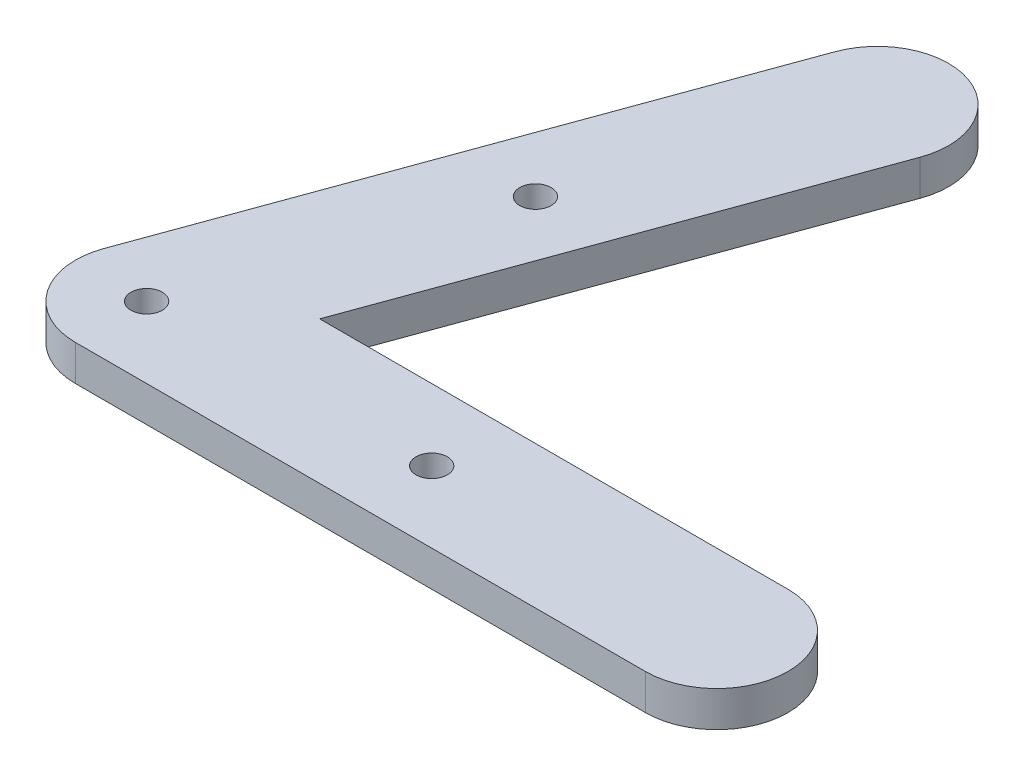
ISO-10303-21;
HEADER;
FILE_DESCRIPTION(('STEP AP214'),'2;1');
FILE_NAME('part.step','',(''),(''),'','','');
FILE_SCHEMA(('AUTOMOTIVE_DESIGN { 1 0 10303 214 1 1 1 1 }'));
ENDSEC;
DATA;
#1=APPLICATION_CONTEXT('core data for automotive mechanical design processes');
#2=APPLICATION_PROTOCOL_DEFINITION('international standard','automotive_design',2000,#1);
#3=PRODUCT_CONTEXT('',#1,'mechanical');
#4=PRODUCT('Part','Part','',(#3));
#5=PRODUCT_RELATED_PRODUCT_CATEGORY('part','',(#4));
#6=PRODUCT_DEFINITION_FORMATION('','',#4);
#7=PRODUCT_DEFINITION_CONTEXT('part definition',#1,'design');
#8=PRODUCT_DEFINITION('design','',#6,#7);
#9=PRODUCT_DEFINITION_SHAPE('','',#8);
#10=(LENGTH_UNIT() NAMED_UNIT(*) SI_UNIT(.MILLI.,.METRE.));
#11=(NAMED_UNIT(*) PLANE_ANGLE_UNIT() SI_UNIT($,.RADIAN.));
#12=(NAMED_UNIT(*) SI_UNIT($,.STERADIAN.) SOLID_ANGLE_UNIT());
#13=UNCERTAINTY_MEASURE_WITH_UNIT(LENGTH_MEASURE(1.E-05),#10,'distance_accuracy_value','');
#14=(GEOMETRIC_REPRESENTATION_CONTEXT(3) GLOBAL_UNCERTAINTY_ASSIGNED_CONTEXT((#13)) GLOBAL_UNIT_ASSIGNED_CONTEXT((#10,
#11,#12)) REPRESENTATION_CONTEXT('',''));
#15=CARTESIAN_POINT('',(0.,0.,0.));
#16=DIRECTION('',(0.,0.,1.));
#17=DIRECTION('',(1.,0.,0.));
#18=AXIS2_PLACEMENT_3D('',#15,#16,#17);
#19=CARTESIAN_POINT('',(-11.934096283981,6.35,-4.34365582023595));
#20=DIRECTION('',(-0.93969262078591,0.,-0.342020143325665));
#21=DIRECTION('',(-0.342020143325665,0.,0.93969262078591));
#22=AXIS2_PLACEMENT_3D('',#19,#20,#21);
#23=PLANE('',#22);
#24=DIRECTION('',(0.342020143325665,0.,-0.93969262078591));
#25=VECTOR('',#24,1.);
#26=CARTESIAN_POINT('',(-11.934096283981,0.,-4.34365582023595));
#27=LINE('',#26,#25);
#28=CARTESIAN_POINT('',(-11.934096283981,0.,-4.34365582023595));
#29=VERTEX_POINT('',#28);
#30=CARTESIAN_POINT('',(22.8151502779066,0.,-99.8164260920844));
#31=VERTEX_POINT('',#30);
#32=EDGE_CURVE('E129',#29,#31,#27,.T.);
#33=ORIENTED_EDGE('',*,*,#32,.F.);
#34=DIRECTION('',(0.,-1.,0.));
#35=VECTOR('',#34,1.);
#36=CARTESIAN_POINT('',(-11.934096283981,6.35,-4.34365582023595));
#37=LINE('',#36,#35);
#38=CARTESIAN_POINT('',(-11.934096283981,6.35,-4.34365582023595));
#39=VERTEX_POINT('',#38);
#40=EDGE_CURVE('E11',#39,#29,#37,.T.);
#41=ORIENTED_EDGE('',*,*,#40,.F.);
#42=DIRECTION('',(0.342020143325665,0.,-0.93969262078591));
#43=VECTOR('',#42,1.);
#44=CARTESIAN_POINT('',(-11.934096283981,6.35,-4.34365582023595));
#45=LINE('',#44,#43);
#46=CARTESIAN_POINT('',(22.8151502779066,6.35,-99.8164260920844));
#47=VERTEX_POINT('',#46);
#48=EDGE_CURVE('E147',#39,#47,#45,.T.);
#49=ORIENTED_EDGE('',*,*,#48,.T.);
#50=DIRECTION('',(0.,-1.,0.));
#51=VECTOR('',#50,1.);
#52=CARTESIAN_POINT('',(22.8151502779066,6.35,-99.8164260920844));
#53=LINE('',#52,#51);
#54=EDGE_CURVE('E84',#47,#31,#53,.T.);
#55=ORIENTED_EDGE('',*,*,#54,.T.);
#56=EDGE_LOOP('',(#33,#41,#49,#55));
#57=FACE_BOUND('',#56,.T.);
#58=ADVANCED_FACE('F37',(#57),#23,.T.);
#59=CARTESIAN_POINT('',(0.,6.35,0.));
#60=DIRECTION('',(0.,-1.,0.));
#61=DIRECTION('',(0.,0.,-1.));
#62=AXIS2_PLACEMENT_3D('',#59,#60,#61);
#63=CYLINDRICAL_SURFACE('',#62,12.7);
#64=CARTESIAN_POINT('',(0.,0.,0.));
#65=DIRECTION('',(0.,1.,0.));
#66=DIRECTION('',(0.,0.,1.));
#67=AXIS2_PLACEMENT_3D('',#64,#65,#66);
#68=CIRCLE('',#67,12.7);
#69=CARTESIAN_POINT('',(0.,0.,12.7));
#70=VERTEX_POINT('',#69);
#71=EDGE_CURVE('E132',#29,#70,#68,.T.);
#72=ORIENTED_EDGE('',*,*,#71,.T.);
#73=DIRECTION('',(0.,-1.,0.));
#74=VECTOR('',#73,1.);
#75=CARTESIAN_POINT('',(0.,6.35,12.7));
#76=LINE('',#75,#74);
#77=CARTESIAN_POINT('',(0.,6.35,12.7));
#78=VERTEX_POINT('',#77);
#79=EDGE_CURVE('E45',#78,#70,#76,.T.);
#80=ORIENTED_EDGE('',*,*,#79,.F.);
#81=CARTESIAN_POINT('',(0.,6.35,0.));
#82=DIRECTION('',(0.,1.,0.));
#83=DIRECTION('',(0.,0.,1.));
#84=AXIS2_PLACEMENT_3D('',#81,#82,#83);
#85=CIRCLE('',#84,12.7);
#86=EDGE_CURVE('E184',#39,#78,#85,.T.);
#87=ORIENTED_EDGE('',*,*,#86,.F.);
#88=ORIENTED_EDGE('',*,*,#40,.T.);
#89=EDGE_LOOP('',(#72,#80,#87,#88));
#90=FACE_BOUND('',#89,.T.);
#91=ADVANCED_FACE('F175',(#90),#63,.T.);
#92=CARTESIAN_POINT('',(0.,6.35,12.7));
#93=DIRECTION('',(0.,0.,-1.));
#94=DIRECTION('',(-1.,0.,0.));
#95=AXIS2_PLACEMENT_3D('',#92,#93,#94);
#96=PLANE('',#95);
#97=DIRECTION('',(1.,0.,0.));
#98=VECTOR('',#97,1.);
#99=CARTESIAN_POINT('',(0.,0.,12.7));
#100=LINE('',#99,#98);
#101=CARTESIAN_POINT('',(101.6,0.,12.7));
#102=VERTEX_POINT('',#101);
#103=EDGE_CURVE('E135',#70,#102,#100,.T.);
#104=ORIENTED_EDGE('',*,*,#103,.T.);
#105=DIRECTION('',(0.,-1.,0.));
#106=VECTOR('',#105,1.);
#107=CARTESIAN_POINT('',(101.6,6.35,12.7));
#108=LINE('',#107,#106);
#109=CARTESIAN_POINT('',(101.6,6.35,12.7));
#110=VERTEX_POINT('',#109);
#111=EDGE_CURVE('E151',#110,#102,#108,.T.);
#112=ORIENTED_EDGE('',*,*,#111,.F.);
#113=DIRECTION('',(1.,0.,0.));
#114=VECTOR('',#113,1.);
#115=CARTESIAN_POINT('',(0.,6.35,12.7));
#116=LINE('',#115,#114);
#117=EDGE_CURVE('E121',#78,#110,#116,.T.);
#118=ORIENTED_EDGE('',*,*,#117,.F.);
#119=ORIENTED_EDGE('',*,*,#79,.T.);
#120=EDGE_LOOP('',(#104,#112,#118,#119));
#121=FACE_BOUND('',#120,.T.);
#122=ADVANCED_FACE('F158',(#121),#96,.F.);
#123=CARTESIAN_POINT('',(101.6,6.35,0.));
#124=DIRECTION('',(0.,-1.,0.));
#125=DIRECTION('',(0.,0.,-1.));
#126=AXIS2_PLACEMENT_3D('',#123,#124,#125);
#127=CYLINDRICAL_SURFACE('',#126,12.7);
#128=CARTESIAN_POINT('',(101.6,0.,0.));
#129=DIRECTION('',(0.,1.,0.));
#130=DIRECTION('',(0.,0.,1.));
#131=AXIS2_PLACEMENT_3D('',#128,#129,#130);
#132=CIRCLE('',#131,12.7);
#133=CARTESIAN_POINT('',(101.6,0.,-12.7));
#134=VERTEX_POINT('',#133);
#135=EDGE_CURVE('E137',#102,#134,#132,.T.);
#136=ORIENTED_EDGE('',*,*,#135,.T.);
#137=DIRECTION('',(0.,-1.,0.));
#138=VECTOR('',#137,1.);
#139=CARTESIAN_POINT('',(101.6,6.35,-12.7));
#140=LINE('',#139,#138);
#141=CARTESIAN_POINT('',(101.6,6.35,-12.7));
#142=VERTEX_POINT('',#141);
#143=EDGE_CURVE('E109',#142,#134,#140,.T.);
#144=ORIENTED_EDGE('',*,*,#143,.F.);
#145=CARTESIAN_POINT('',(101.6,6.35,0.));
#146=DIRECTION('',(0.,1.,0.));
#147=DIRECTION('',(0.,0.,1.));
#148=AXIS2_PLACEMENT_3D('',#145,#146,#147);
#149=CIRCLE('',#148,12.7);
#150=EDGE_CURVE('E118',#110,#142,#149,.T.);
#151=ORIENTED_EDGE('',*,*,#150,.F.);
#152=ORIENTED_EDGE('',*,*,#111,.T.);
#153=EDGE_LOOP('',(#136,#144,#151,#152));
#154=FACE_BOUND('',#153,.T.);
#155=ADVANCED_FACE('F167',(#154),#127,.T.);
#156=CARTESIAN_POINT('',(0.,6.35,-12.7));
#157=DIRECTION('',(0.,0.,-1.));
#158=DIRECTION('',(-1.,0.,0.));
#159=AXIS2_PLACEMENT_3D('',#156,#157,#158);
#160=PLANE('',#159);
#161=DIRECTION('',(1.,0.,0.));
#162=VECTOR('',#161,1.);
#163=CARTESIAN_POINT('',(0.,0.,-12.7));
#164=LINE('',#163,#162);
#165=CARTESIAN_POINT('',(18.1374796856248,0.,-12.7));
#166=VERTEX_POINT('',#165);
#167=EDGE_CURVE('E108',#166,#134,#164,.T.);
#168=ORIENTED_EDGE('',*,*,#167,.F.);
#169=DIRECTION('',(0.,-1.,0.));
#170=VECTOR('',#169,1.);
#171=CARTESIAN_POINT('',(18.1374796856248,6.35,-12.7));
#172=LINE('',#171,#170);
#173=CARTESIAN_POINT('',(18.1374796856248,6.35,-12.7));
#174=VERTEX_POINT('',#173);
#175=EDGE_CURVE('E102',#174,#166,#172,.T.);
#176=ORIENTED_EDGE('',*,*,#175,.F.);
#177=DIRECTION('',(1.,0.,0.));
#178=VECTOR('',#177,1.);
#179=CARTESIAN_POINT('',(0.,6.35,-12.7));
#180=LINE('',#179,#178);
#181=EDGE_CURVE('E106',#174,#142,#180,.T.);
#182=ORIENTED_EDGE('',*,*,#181,.T.);
#183=ORIENTED_EDGE('',*,*,#143,.T.);
#184=EDGE_LOOP('',(#168,#176,#182,#183));
#185=FACE_BOUND('',#184,.T.);
#186=ADVANCED_FACE('F104',(#185),#160,.T.);
#187=CARTESIAN_POINT('',(11.934096283981,6.35,4.34365582023595));
#188=DIRECTION('',(-0.939692620785909,0.,-0.342020143325666));
#189=DIRECTION('',(-0.342020143325666,0.,0.93969262078591));
#190=AXIS2_PLACEMENT_3D('',#187,#188,#189);
#191=PLANE('',#190);
#192=DIRECTION('',(0.342020143325666,0.,-0.93969262078591));
#193=VECTOR('',#192,1.);
#194=CARTESIAN_POINT('',(11.934096283981,0.,4.34365582023595));
#195=LINE('',#194,#193);
#196=CARTESIAN_POINT('',(46.6833428458687,0.,-91.1291144516125));
#197=VERTEX_POINT('',#196);
#198=EDGE_CURVE('E77',#166,#197,#195,.T.);
#199=ORIENTED_EDGE('',*,*,#198,.T.);
#200=DIRECTION('',(0.,-1.,0.));
#201=VECTOR('',#200,1.);
#202=CARTESIAN_POINT('',(46.6833428458687,6.35,-91.1291144516125));
#203=LINE('',#202,#201);
#204=CARTESIAN_POINT('',(46.6833428458687,6.35,-91.1291144516125));
#205=VERTEX_POINT('',#204);
#206=EDGE_CURVE('E110',#205,#197,#203,.T.);
#207=ORIENTED_EDGE('',*,*,#206,.F.);
#208=DIRECTION('',(0.342020143325666,0.,-0.93969262078591));
#209=VECTOR('',#208,1.);
#210=CARTESIAN_POINT('',(11.934096283981,6.35,4.34365582023595));
#211=LINE('',#210,#209);
#212=EDGE_CURVE('E112',#174,#205,#211,.T.);
#213=ORIENTED_EDGE('',*,*,#212,.F.);
#214=ORIENTED_EDGE('',*,*,#175,.T.);
#215=EDGE_LOOP('',(#199,#207,#213,#214));
#216=FACE_BOUND('',#215,.T.);
#217=ADVANCED_FACE('F113',(#216),#191,.F.);
#218=CARTESIAN_POINT('',(34.7492465618876,6.35,-95.4727702718484));
#219=DIRECTION('',(0.,-1.,0.));
#220=DIRECTION('',(0.,0.,-1.));
#221=AXIS2_PLACEMENT_3D('',#218,#219,#220);
#222=CYLINDRICAL_SURFACE('',#221,12.7);
#223=CARTESIAN_POINT('',(34.7492465618876,0.,-95.4727702718484));
#224=DIRECTION('',(0.,1.,0.));
#225=DIRECTION('',(0.,0.,1.));
#226=AXIS2_PLACEMENT_3D('',#223,#224,#225);
#227=CIRCLE('',#226,12.7);
#228=EDGE_CURVE('E142',#197,#31,#227,.T.);
#229=ORIENTED_EDGE('',*,*,#228,.T.);
#230=ORIENTED_EDGE('',*,*,#54,.F.);
#231=CARTESIAN_POINT('',(34.7492465618876,6.35,-95.4727702718484));
#232=DIRECTION('',(0.,1.,0.));
#233=DIRECTION('',(0.,0.,1.));
#234=AXIS2_PLACEMENT_3D('',#231,#232,#233);
#235=CIRCLE('',#234,12.7);
#236=EDGE_CURVE('E53',#205,#47,#235,.T.);
#237=ORIENTED_EDGE('',*,*,#236,.F.);
#238=ORIENTED_EDGE('',*,*,#206,.T.);
#239=EDGE_LOOP('',(#229,#230,#237,#238));
#240=FACE_BOUND('',#239,.T.);
#241=ADVANCED_FACE('F183',(#240),#222,.T.);
#242=CARTESIAN_POINT('',(0.,6.35,0.));
#243=DIRECTION('',(0.,-1.,0.));
#244=DIRECTION('',(0.,0.,-1.));
#245=AXIS2_PLACEMENT_3D('',#242,#243,#244);
#246=CYLINDRICAL_SURFACE('',#245,2.794);
#247=CARTESIAN_POINT('',(0.,6.35,0.));
#248=DIRECTION('',(0.,1.,0.));
#249=DIRECTION('',(0.,0.,1.));
#250=AXIS2_PLACEMENT_3D('',#247,#248,#249);
#251=CIRCLE('',#250,2.794);
#252=CARTESIAN_POINT('',(0.,6.35,2.79400000000001));
#253=VERTEX_POINT('',#252);
#254=EDGE_CURVE('E126',#253,#253,#251,.T.);
#255=ORIENTED_EDGE('',*,*,#254,.T.);
#256=EDGE_LOOP('',(#255));
#257=FACE_BOUND('',#256,.T.);
#258=CARTESIAN_POINT('',(0.,0.,0.));
#259=DIRECTION('',(0.,1.,0.));
#260=DIRECTION('',(0.,0.,1.));
#261=AXIS2_PLACEMENT_3D('',#258,#259,#260);
#262=CIRCLE('',#261,2.794);
#263=CARTESIAN_POINT('',(0.,0.,2.79400000000001));
#264=VERTEX_POINT('',#263);
#265=EDGE_CURVE('E144',#264,#264,#262,.T.);
#266=ORIENTED_EDGE('',*,*,#265,.F.);
#267=EDGE_LOOP('',(#266));
#268=FACE_BOUND('',#267,.T.);
#269=ADVANCED_FACE('F222',(#257,#268),#246,.F.);
#270=CARTESIAN_POINT('',(0.,6.35,0.));
#271=DIRECTION('',(0.,1.,0.));
#272=DIRECTION('',(0.,0.,1.));
#273=AXIS2_PLACEMENT_3D('',#270,#271,#272);
#274=PLANE('',#273);
#275=CARTESIAN_POINT('',(50.8,6.35,0.));
#276=DIRECTION('',(0.,-1.,0.));
#277=DIRECTION('',(0.,0.,-1.));
#278=AXIS2_PLACEMENT_3D('',#275,#276,#277);
#279=CIRCLE('',#278,2.794);
#280=CARTESIAN_POINT('',(50.8,6.35,-2.794));
#281=VERTEX_POINT('',#280);
#282=EDGE_CURVE('E133',#281,#281,#279,.T.);
#283=ORIENTED_EDGE('',*,*,#282,.T.);
#284=EDGE_LOOP('',(#283));
#285=FACE_BOUND('',#284,.T.);
#286=CARTESIAN_POINT('',(18.4896879007229,6.35,-50.8));
#287=DIRECTION('',(0.,-1.,0.));
#288=DIRECTION('',(0.,0.,-1.));
#289=AXIS2_PLACEMENT_3D('',#286,#287,#288);
#290=CIRCLE('',#289,2.794);
#291=CARTESIAN_POINT('',(18.4896879007229,6.35,-53.594));
#292=VERTEX_POINT('',#291);
#293=EDGE_CURVE('E191',#292,#292,#290,.T.);
#294=ORIENTED_EDGE('',*,*,#293,.T.);
#295=EDGE_LOOP('',(#294));
#296=FACE_BOUND('',#295,.T.);
#297=ORIENTED_EDGE('',*,*,#48,.F.);
#298=ORIENTED_EDGE('',*,*,#86,.T.);
#299=ORIENTED_EDGE('',*,*,#117,.T.);
#300=ORIENTED_EDGE('',*,*,#150,.T.);
#301=ORIENTED_EDGE('',*,*,#181,.F.);
#302=ORIENTED_EDGE('',*,*,#212,.T.);
#303=ORIENTED_EDGE('',*,*,#236,.T.);
#304=EDGE_LOOP('',(#297,#298,#299,#300,#301,#302,#303));
#305=FACE_BOUND('',#304,.T.);
#306=ORIENTED_EDGE('',*,*,#254,.F.);
#307=EDGE_LOOP('',(#306));
#308=FACE_BOUND('',#307,.T.);
#309=ADVANCED_FACE('F115',(#285,#296,#305,#308),#274,.T.);
#310=CARTESIAN_POINT('',(0.,0.,0.));
#311=DIRECTION('',(0.,1.,0.));
#312=DIRECTION('',(0.,0.,1.));
#313=AXIS2_PLACEMENT_3D('',#310,#311,#312);
#314=PLANE('',#313);
#315=CARTESIAN_POINT('',(50.8,0.,0.));
#316=DIRECTION('',(0.,-1.,0.));
#317=DIRECTION('',(0.,0.,-1.));
#318=AXIS2_PLACEMENT_3D('',#315,#316,#317);
#319=CIRCLE('',#318,2.794);
#320=CARTESIAN_POINT('',(50.8,0.,-2.794));
#321=VERTEX_POINT('',#320);
#322=EDGE_CURVE('E194',#321,#321,#319,.T.);
#323=ORIENTED_EDGE('',*,*,#322,.F.);
#324=EDGE_LOOP('',(#323));
#325=FACE_BOUND('',#324,.T.);
#326=CARTESIAN_POINT('',(18.4896879007229,0.,-50.8));
#327=DIRECTION('',(0.,-1.,0.));
#328=DIRECTION('',(0.,0.,-1.));
#329=AXIS2_PLACEMENT_3D('',#326,#327,#328);
#330=CIRCLE('',#329,2.794);
#331=CARTESIAN_POINT('',(18.4896879007229,0.,-53.594));
#332=VERTEX_POINT('',#331);
#333=EDGE_CURVE('E188',#332,#332,#330,.T.);
#334=ORIENTED_EDGE('',*,*,#333,.F.);
#335=EDGE_LOOP('',(#334));
#336=FACE_BOUND('',#335,.T.);
#337=ORIENTED_EDGE('',*,*,#32,.T.);
#338=ORIENTED_EDGE('',*,*,#228,.F.);
#339=ORIENTED_EDGE('',*,*,#198,.F.);
#340=ORIENTED_EDGE('',*,*,#167,.T.);
#341=ORIENTED_EDGE('',*,*,#135,.F.);
#342=ORIENTED_EDGE('',*,*,#103,.F.);
#343=ORIENTED_EDGE('',*,*,#71,.F.);
#344=EDGE_LOOP('',(#337,#338,#339,#340,#341,#342,#343));
#345=FACE_BOUND('',#344,.T.);
#346=ORIENTED_EDGE('',*,*,#265,.T.);
#347=EDGE_LOOP('',(#346));
#348=FACE_BOUND('',#347,.T.);
#349=ADVANCED_FACE('F164',(#325,#336,#345,#348),#314,.F.);
#350=CARTESIAN_POINT('',(18.4896879007229,6.35,-50.8));
#351=DIRECTION('',(0.,-1.,0.));
#352=DIRECTION('',(0.,0.,-1.));
#353=AXIS2_PLACEMENT_3D('',#350,#351,#352);
#354=CYLINDRICAL_SURFACE('',#353,2.794);
#355=ORIENTED_EDGE('',*,*,#293,.F.);
#356=EDGE_LOOP('',(#355));
#357=FACE_BOUND('',#356,.T.);
#358=ORIENTED_EDGE('',*,*,#333,.T.);
#359=EDGE_LOOP('',(#358));
#360=FACE_BOUND('',#359,.T.);
#361=ADVANCED_FACE('F205',(#357,#360),#354,.F.);
#362=CARTESIAN_POINT('',(50.8,6.35,0.));
#363=DIRECTION('',(0.,-1.,0.));
#364=DIRECTION('',(0.,0.,-1.));
#365=AXIS2_PLACEMENT_3D('',#362,#363,#364);
#366=CYLINDRICAL_SURFACE('',#365,2.794);
#367=ORIENTED_EDGE('',*,*,#282,.F.);
#368=EDGE_LOOP('',(#367));
#369=FACE_BOUND('',#368,.T.);
#370=ORIENTED_EDGE('',*,*,#322,.T.);
#371=EDGE_LOOP('',(#370));
#372=FACE_BOUND('',#371,.T.);
#373=ADVANCED_FACE('F202',(#369,#372),#366,.F.);
#374=CLOSED_SHELL('',(#58,#91,#122,#155,#186,#217,#241,#269,#309,#349,#361,#373));
#375=MANIFOLD_SOLID_BREP('B2',#374);
#376=ADVANCED_BREP_SHAPE_REPRESENTATION('',(#18,#375),#14);
#377=SHAPE_DEFINITION_REPRESENTATION(#9,#376);
ENDSEC;
END-ISO-10303-21;
